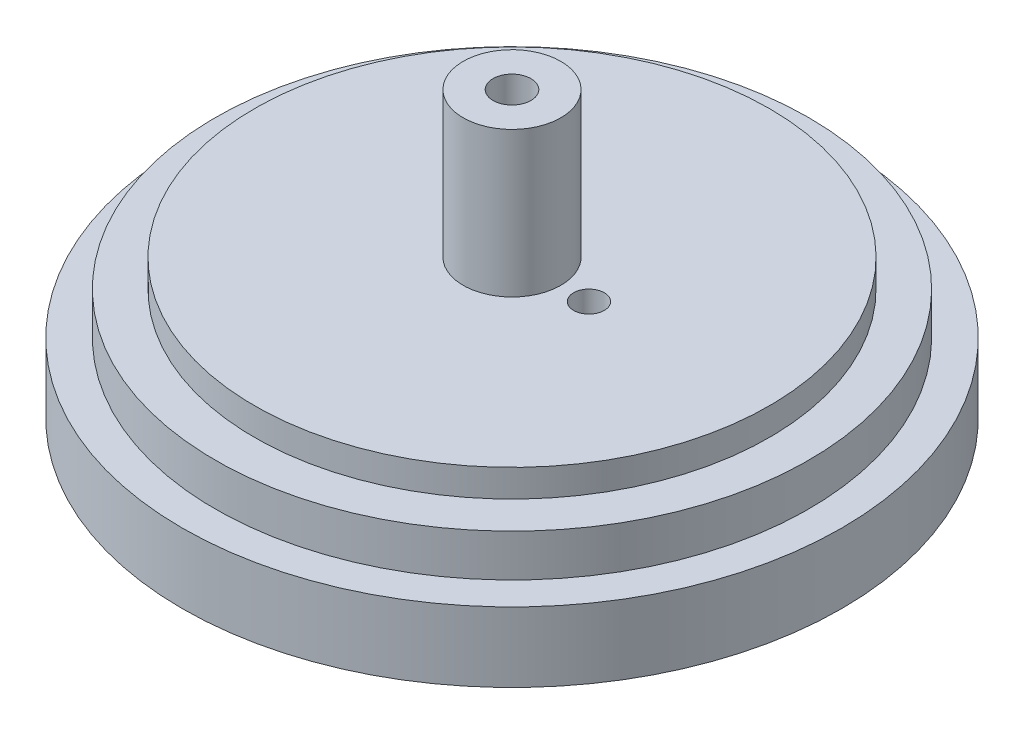
ISO-10303-21;
HEADER;
FILE_DESCRIPTION(('STEP AP214'),'2;1');
FILE_NAME('part.step','',(''),(''),'','','');
FILE_SCHEMA(('AUTOMOTIVE_DESIGN { 1 0 10303 214 1 1 1 1 }'));
ENDSEC;
DATA;
#1=APPLICATION_CONTEXT('core data for automotive mechanical design processes');
#2=APPLICATION_PROTOCOL_DEFINITION('international standard','automotive_design',2000,#1);
#3=PRODUCT_CONTEXT('',#1,'mechanical');
#4=PRODUCT('Part','Part','',(#3));
#5=PRODUCT_RELATED_PRODUCT_CATEGORY('part','',(#4));
#6=PRODUCT_DEFINITION_FORMATION('','',#4);
#7=PRODUCT_DEFINITION_CONTEXT('part definition',#1,'design');
#8=PRODUCT_DEFINITION('design','',#6,#7);
#9=PRODUCT_DEFINITION_SHAPE('','',#8);
#10=(LENGTH_UNIT() NAMED_UNIT(*) SI_UNIT(.MILLI.,.METRE.));
#11=(NAMED_UNIT(*) PLANE_ANGLE_UNIT() SI_UNIT($,.RADIAN.));
#12=(NAMED_UNIT(*) SI_UNIT($,.STERADIAN.) SOLID_ANGLE_UNIT());
#13=UNCERTAINTY_MEASURE_WITH_UNIT(LENGTH_MEASURE(1.E-05),#10,'distance_accuracy_value','');
#14=(GEOMETRIC_REPRESENTATION_CONTEXT(3) GLOBAL_UNCERTAINTY_ASSIGNED_CONTEXT((#13)) GLOBAL_UNIT_ASSIGNED_CONTEXT((#10,
#11,#12)) REPRESENTATION_CONTEXT('',''));
#15=CARTESIAN_POINT('',(0.,0.,0.));
#16=DIRECTION('',(0.,0.,1.));
#17=DIRECTION('',(1.,0.,0.));
#18=AXIS2_PLACEMENT_3D('',#15,#16,#17);
#19=CARTESIAN_POINT('',(0.,13.208,0.));
#20=DIRECTION('',(0.,1.,0.));
#21=DIRECTION('',(0.,0.,1.));
#22=AXIS2_PLACEMENT_3D('',#19,#20,#21);
#23=CYLINDRICAL_SURFACE('',#22,1.72719999999999);
#24=CARTESIAN_POINT('',(0.,13.208,0.));
#25=DIRECTION('',(0.,1.,0.));
#26=DIRECTION('',(0.,0.,1.));
#27=AXIS2_PLACEMENT_3D('',#24,#25,#26);
#28=CIRCLE('',#27,1.72719999999999);
#29=CARTESIAN_POINT('',(0.,13.208,1.72719999999999));
#30=VERTEX_POINT('',#29);
#31=EDGE_CURVE('E143',#30,#30,#28,.T.);
#32=ORIENTED_EDGE('',*,*,#31,.T.);
#33=EDGE_LOOP('',(#32));
#34=FACE_BOUND('',#33,.T.);
#35=CARTESIAN_POINT('',(0.,-4.2,0.));
#36=DIRECTION('',(0.,-1.,0.));
#37=DIRECTION('',(0.,0.,-1.));
#38=AXIS2_PLACEMENT_3D('',#35,#36,#37);
#39=CIRCLE('',#38,1.72719999999999);
#40=CARTESIAN_POINT('',(0.,-4.2,-1.72719999999999));
#41=VERTEX_POINT('',#40);
#42=EDGE_CURVE('E38',#41,#41,#39,.F.);
#43=ORIENTED_EDGE('',*,*,#42,.F.);
#44=EDGE_LOOP('',(#43));
#45=FACE_BOUND('',#44,.T.);
#46=ADVANCED_FACE('F34',(#34,#45),#23,.F.);
#47=CARTESIAN_POINT('',(0.,0.,0.));
#48=DIRECTION('',(0.,-1.,0.));
#49=DIRECTION('',(0.,0.,-1.));
#50=AXIS2_PLACEMENT_3D('',#47,#48,#49);
#51=PLANE('',#50);
#52=CARTESIAN_POINT('',(0.,0.,0.));
#53=DIRECTION('',(0.,-1.,0.));
#54=DIRECTION('',(0.,0.,-1.));
#55=AXIS2_PLACEMENT_3D('',#52,#53,#54);
#56=CIRCLE('',#55,4.445);
#57=CARTESIAN_POINT('',(0.,0.,-4.445));
#58=VERTEX_POINT('',#57);
#59=EDGE_CURVE('E11',#58,#58,#56,.F.);
#60=ORIENTED_EDGE('',*,*,#59,.F.);
#61=EDGE_LOOP('',(#60));
#62=FACE_BOUND('',#61,.T.);
#63=CARTESIAN_POINT('',(7.,0.,0.));
#64=DIRECTION('',(0.,-1.,0.));
#65=DIRECTION('',(0.,0.,-1.));
#66=AXIS2_PLACEMENT_3D('',#63,#64,#65);
#67=CIRCLE('',#66,1.397);
#68=CARTESIAN_POINT('',(7.,0.,1.397));
#69=VERTEX_POINT('',#68);
#70=EDGE_CURVE('E150',#69,#69,#67,.T.);
#71=ORIENTED_EDGE('',*,*,#70,.T.);
#72=EDGE_LOOP('',(#71));
#73=FACE_BOUND('',#72,.T.);
#74=CARTESIAN_POINT('',(0.,0.,0.));
#75=DIRECTION('',(0.,-1.,0.));
#76=DIRECTION('',(0.,0.,-1.));
#77=AXIS2_PLACEMENT_3D('',#74,#75,#76);
#78=CIRCLE('',#77,23.425);
#79=CARTESIAN_POINT('',(0.,0.,-23.425));
#80=VERTEX_POINT('',#79);
#81=EDGE_CURVE('E43',#80,#80,#78,.T.);
#82=ORIENTED_EDGE('',*,*,#81,.F.);
#83=EDGE_LOOP('',(#82));
#84=FACE_BOUND('',#83,.T.);
#85=ADVANCED_FACE('F36',(#62,#73,#84),#51,.F.);
#86=CARTESIAN_POINT('',(0.,-12.7,0.));
#87=DIRECTION('',(0.,-1.,0.));
#88=DIRECTION('',(0.,0.,-1.));
#89=AXIS2_PLACEMENT_3D('',#86,#87,#88);
#90=CYLINDRICAL_SURFACE('',#89,23.425);
#91=CARTESIAN_POINT('',(0.,-2.5,0.));
#92=DIRECTION('',(0.,-1.,0.));
#93=DIRECTION('',(0.,0.,-1.));
#94=AXIS2_PLACEMENT_3D('',#91,#92,#93);
#95=CIRCLE('',#94,23.425);
#96=CARTESIAN_POINT('',(0.,-2.5,-23.425));
#97=VERTEX_POINT('',#96);
#98=EDGE_CURVE('E167',#97,#97,#95,.T.);
#99=ORIENTED_EDGE('',*,*,#98,.F.);
#100=EDGE_LOOP('',(#99));
#101=FACE_BOUND('',#100,.T.);
#102=ORIENTED_EDGE('',*,*,#81,.T.);
#103=EDGE_LOOP('',(#102));
#104=FACE_BOUND('',#103,.T.);
#105=ADVANCED_FACE('F173',(#101,#104),#90,.T.);
#106=CARTESIAN_POINT('',(-27.,-2.5,0.));
#107=DIRECTION('',(0.,-1.,0.));
#108=DIRECTION('',(0.,0.,-1.));
#109=AXIS2_PLACEMENT_3D('',#106,#107,#108);
#110=PLANE('',#109);
#111=CARTESIAN_POINT('',(0.,-2.5,0.));
#112=DIRECTION('',(0.,-1.,0.));
#113=DIRECTION('',(0.,0.,-1.));
#114=AXIS2_PLACEMENT_3D('',#111,#112,#113);
#115=CIRCLE('',#114,27.);
#116=CARTESIAN_POINT('',(0.,-2.5,-27.));
#117=VERTEX_POINT('',#116);
#118=EDGE_CURVE('E164',#117,#117,#115,.T.);
#119=ORIENTED_EDGE('',*,*,#118,.F.);
#120=EDGE_LOOP('',(#119));
#121=FACE_BOUND('',#120,.T.);
#122=ORIENTED_EDGE('',*,*,#98,.T.);
#123=EDGE_LOOP('',(#122));
#124=FACE_BOUND('',#123,.T.);
#125=ADVANCED_FACE('F181',(#121,#124),#110,.F.);
#126=CARTESIAN_POINT('',(0.,-12.7,0.));
#127=DIRECTION('',(0.,-1.,0.));
#128=DIRECTION('',(0.,0.,-1.));
#129=AXIS2_PLACEMENT_3D('',#126,#127,#128);
#130=CYLINDRICAL_SURFACE('',#129,27.);
#131=CARTESIAN_POINT('',(0.,-6.35,0.));
#132=DIRECTION('',(0.,-1.,0.));
#133=DIRECTION('',(0.,0.,-1.));
#134=AXIS2_PLACEMENT_3D('',#131,#132,#133);
#135=CIRCLE('',#134,27.);
#136=CARTESIAN_POINT('',(0.,-6.35,-27.));
#137=VERTEX_POINT('',#136);
#138=EDGE_CURVE('E161',#137,#137,#135,.T.);
#139=ORIENTED_EDGE('',*,*,#138,.F.);
#140=EDGE_LOOP('',(#139));
#141=FACE_BOUND('',#140,.T.);
#142=ORIENTED_EDGE('',*,*,#118,.T.);
#143=EDGE_LOOP('',(#142));
#144=FACE_BOUND('',#143,.T.);
#145=ADVANCED_FACE('F212',(#141,#144),#130,.T.);
#146=CARTESIAN_POINT('',(-30.,-6.35,0.));
#147=DIRECTION('',(0.,-1.,0.));
#148=DIRECTION('',(0.,0.,-1.));
#149=AXIS2_PLACEMENT_3D('',#146,#147,#148);
#150=PLANE('',#149);
#151=CARTESIAN_POINT('',(0.,-6.35,0.));
#152=DIRECTION('',(0.,-1.,0.));
#153=DIRECTION('',(0.,0.,-1.));
#154=AXIS2_PLACEMENT_3D('',#151,#152,#153);
#155=CIRCLE('',#154,30.);
#156=CARTESIAN_POINT('',(0.,-6.35,-30.));
#157=VERTEX_POINT('',#156);
#158=EDGE_CURVE('E158',#157,#157,#155,.T.);
#159=ORIENTED_EDGE('',*,*,#158,.F.);
#160=EDGE_LOOP('',(#159));
#161=FACE_BOUND('',#160,.T.);
#162=ORIENTED_EDGE('',*,*,#138,.T.);
#163=EDGE_LOOP('',(#162));
#164=FACE_BOUND('',#163,.T.);
#165=ADVANCED_FACE('F206',(#161,#164),#150,.F.);
#166=CARTESIAN_POINT('',(0.,-12.7,0.));
#167=DIRECTION('',(0.,-1.,0.));
#168=DIRECTION('',(0.,0.,-1.));
#169=AXIS2_PLACEMENT_3D('',#166,#167,#168);
#170=CYLINDRICAL_SURFACE('',#169,30.);
#171=CARTESIAN_POINT('',(0.,-12.7,0.));
#172=DIRECTION('',(0.,-1.,0.));
#173=DIRECTION('',(0.,0.,-1.));
#174=AXIS2_PLACEMENT_3D('',#171,#172,#173);
#175=CIRCLE('',#174,30.);
#176=CARTESIAN_POINT('',(0.,-12.7,-30.));
#177=VERTEX_POINT('',#176);
#178=EDGE_CURVE('E153',#177,#177,#175,.T.);
#179=ORIENTED_EDGE('',*,*,#178,.F.);
#180=EDGE_LOOP('',(#179));
#181=FACE_BOUND('',#180,.T.);
#182=ORIENTED_EDGE('',*,*,#158,.T.);
#183=EDGE_LOOP('',(#182));
#184=FACE_BOUND('',#183,.T.);
#185=ADVANCED_FACE('F199',(#181,#184),#170,.T.);
#186=CARTESIAN_POINT('',(-30.,-12.7,0.));
#187=DIRECTION('',(0.,1.,0.));
#188=DIRECTION('',(0.,0.,1.));
#189=AXIS2_PLACEMENT_3D('',#186,#187,#188);
#190=PLANE('',#189);
#191=DIRECTION('',(-0.866025403784438,0.,-0.5));
#192=VECTOR('',#191,1.);
#193=CARTESIAN_POINT('',(0.,-12.7,3.81282117772829));
#194=LINE('',#193,#192);
#195=CARTESIAN_POINT('',(0.,-12.7,3.81282117772829));
#196=VERTEX_POINT('',#195);
#197=CARTESIAN_POINT('',(-3.302,-12.7,1.90641058886414));
#198=VERTEX_POINT('',#197);
#199=EDGE_CURVE('E125',#196,#198,#194,.T.);
#200=ORIENTED_EDGE('',*,*,#199,.F.);
#201=DIRECTION('',(-0.866025403784439,0.,0.5));
#202=VECTOR('',#201,1.);
#203=CARTESIAN_POINT('',(3.302,-12.7,1.90641058886414));
#204=LINE('',#203,#202);
#205=CARTESIAN_POINT('',(3.302,-12.7,1.90641058886414));
#206=VERTEX_POINT('',#205);
#207=EDGE_CURVE('E50',#206,#196,#204,.T.);
#208=ORIENTED_EDGE('',*,*,#207,.F.);
#209=DIRECTION('',(0.,0.,1.));
#210=VECTOR('',#209,1.);
#211=CARTESIAN_POINT('',(3.302,-12.7,-1.90641058886414));
#212=LINE('',#211,#210);
#213=CARTESIAN_POINT('',(3.302,-12.7,-1.90641058886414));
#214=VERTEX_POINT('',#213);
#215=EDGE_CURVE('E134',#214,#206,#212,.T.);
#216=ORIENTED_EDGE('',*,*,#215,.F.);
#217=DIRECTION('',(0.866025403784439,0.,0.5));
#218=VECTOR('',#217,1.);
#219=CARTESIAN_POINT('',(0.,-12.7,-3.81282117772829));
#220=LINE('',#219,#218);
#221=CARTESIAN_POINT('',(0.,-12.7,-3.81282117772829));
#222=VERTEX_POINT('',#221);
#223=EDGE_CURVE('E132',#222,#214,#220,.T.);
#224=ORIENTED_EDGE('',*,*,#223,.F.);
#225=DIRECTION('',(0.866025403784439,0.,-0.5));
#226=VECTOR('',#225,1.);
#227=CARTESIAN_POINT('',(-3.302,-12.7,-1.90641058886415));
#228=LINE('',#227,#226);
#229=CARTESIAN_POINT('',(-3.302,-12.7,-1.90641058886415));
#230=VERTEX_POINT('',#229);
#231=EDGE_CURVE('E98',#230,#222,#228,.T.);
#232=ORIENTED_EDGE('',*,*,#231,.F.);
#233=DIRECTION('',(0.,0.,-1.));
#234=VECTOR('',#233,1.);
#235=CARTESIAN_POINT('',(-3.302,-12.7,1.90641058886414));
#236=LINE('',#235,#234);
#237=EDGE_CURVE('E128',#198,#230,#236,.T.);
#238=ORIENTED_EDGE('',*,*,#237,.F.);
#239=EDGE_LOOP('',(#200,#208,#216,#224,#232,#238));
#240=FACE_BOUND('',#239,.T.);
#241=CARTESIAN_POINT('',(7.,-12.7,0.));
#242=DIRECTION('',(0.,1.,0.));
#243=DIRECTION('',(0.,0.,1.));
#244=AXIS2_PLACEMENT_3D('',#241,#242,#243);
#245=CIRCLE('',#244,1.397);
#246=CARTESIAN_POINT('',(7.,-12.7,1.397));
#247=VERTEX_POINT('',#246);
#248=EDGE_CURVE('E149',#247,#247,#245,.T.);
#249=ORIENTED_EDGE('',*,*,#248,.T.);
#250=EDGE_LOOP('',(#249));
#251=FACE_BOUND('',#250,.T.);
#252=ORIENTED_EDGE('',*,*,#178,.T.);
#253=EDGE_LOOP('',(#252));
#254=FACE_BOUND('',#253,.T.);
#255=ADVANCED_FACE('F193',(#240,#251,#254),#190,.F.);
#256=CARTESIAN_POINT('',(7.,-12.701,0.));
#257=DIRECTION('',(0.,1.,0.));
#258=DIRECTION('',(0.,0.,1.));
#259=AXIS2_PLACEMENT_3D('',#256,#257,#258);
#260=CYLINDRICAL_SURFACE('',#259,1.397);
#261=CARTESIAN_POINT('',(7.,0.,1.397));
#262=CARTESIAN_POINT('',(7.,-0.132291666666667,1.397));
#263=CARTESIAN_POINT('',(7.,-0.264583333333333,1.397));
#264=CARTESIAN_POINT('',(7.,-0.529166666666667,1.397));
#265=CARTESIAN_POINT('',(7.,-0.661458333333334,1.397));
#266=CARTESIAN_POINT('',(7.,-0.926041666666668,1.397));
#267=CARTESIAN_POINT('',(7.,-1.05833333333333,1.397));
#268=CARTESIAN_POINT('',(7.,-1.32291666666667,1.397));
#269=CARTESIAN_POINT('',(7.,-1.45520833333333,1.397));
#270=CARTESIAN_POINT('',(7.,-1.71979166666667,1.397));
#271=CARTESIAN_POINT('',(7.,-1.85208333333333,1.397));
#272=CARTESIAN_POINT('',(7.,-2.11666666666667,1.397));
#273=CARTESIAN_POINT('',(7.,-2.24895833333333,1.397));
#274=CARTESIAN_POINT('',(7.,-2.51354166666667,1.397));
#275=CARTESIAN_POINT('',(7.,-2.64583333333333,1.397));
#276=CARTESIAN_POINT('',(7.,-2.91041666666667,1.397));
#277=CARTESIAN_POINT('',(7.,-3.04270833333333,1.397));
#278=CARTESIAN_POINT('',(7.,-3.30729166666667,1.397));
#279=CARTESIAN_POINT('',(7.,-3.43958333333333,1.397));
#280=CARTESIAN_POINT('',(7.,-3.70416666666667,1.397));
#281=CARTESIAN_POINT('',(7.,-3.83645833333334,1.397));
#282=CARTESIAN_POINT('',(7.,-4.10104166666667,1.397));
#283=CARTESIAN_POINT('',(7.,-4.23333333333333,1.397));
#284=CARTESIAN_POINT('',(7.,-4.49791666666667,1.397));
#285=CARTESIAN_POINT('',(7.,-4.63020833333334,1.397));
#286=CARTESIAN_POINT('',(7.,-4.89479166666667,1.397));
#287=CARTESIAN_POINT('',(7.,-5.02708333333334,1.397));
#288=CARTESIAN_POINT('',(7.,-5.29166666666667,1.397));
#289=CARTESIAN_POINT('',(7.,-5.42395833333333,1.397));
#290=CARTESIAN_POINT('',(7.,-5.68854166666667,1.397));
#291=CARTESIAN_POINT('',(7.,-5.82083333333333,1.397));
#292=CARTESIAN_POINT('',(7.,-6.08541666666667,1.397));
#293=CARTESIAN_POINT('',(7.,-6.21770833333334,1.397));
#294=CARTESIAN_POINT('',(7.,-6.48229166666667,1.397));
#295=CARTESIAN_POINT('',(7.,-6.61458333333334,1.397));
#296=CARTESIAN_POINT('',(7.,-6.87916666666667,1.397));
#297=CARTESIAN_POINT('',(7.,-7.01145833333334,1.397));
#298=CARTESIAN_POINT('',(7.,-7.27604166666667,1.397));
#299=CARTESIAN_POINT('',(7.,-7.40833333333334,1.397));
#300=CARTESIAN_POINT('',(7.,-7.67291666666667,1.397));
#301=CARTESIAN_POINT('',(7.,-7.80520833333334,1.397));
#302=CARTESIAN_POINT('',(7.,-8.06979166666667,1.397));
#303=CARTESIAN_POINT('',(7.,-8.20208333333334,1.397));
#304=CARTESIAN_POINT('',(7.,-8.46666666666667,1.397));
#305=CARTESIAN_POINT('',(7.,-8.59895833333334,1.397));
#306=CARTESIAN_POINT('',(7.,-8.86354166666667,1.397));
#307=CARTESIAN_POINT('',(7.,-8.99583333333334,1.397));
#308=CARTESIAN_POINT('',(7.,-9.26041666666667,1.397));
#309=CARTESIAN_POINT('',(7.,-9.39270833333334,1.397));
#310=CARTESIAN_POINT('',(7.,-9.65729166666667,1.397));
#311=CARTESIAN_POINT('',(7.,-9.78958333333334,1.397));
#312=CARTESIAN_POINT('',(7.,-10.0541666666667,1.397));
#313=CARTESIAN_POINT('',(7.,-10.1864583333333,1.397));
#314=CARTESIAN_POINT('',(7.,-10.4510416666667,1.397));
#315=CARTESIAN_POINT('',(7.,-10.5833333333333,1.397));
#316=CARTESIAN_POINT('',(7.,-10.8479166666667,1.397));
#317=CARTESIAN_POINT('',(7.,-10.9802083333333,1.397));
#318=CARTESIAN_POINT('',(7.,-11.2447916666667,1.397));
#319=CARTESIAN_POINT('',(7.,-11.3770833333333,1.397));
#320=CARTESIAN_POINT('',(7.,-11.6416666666667,1.397));
#321=CARTESIAN_POINT('',(7.,-11.7739583333333,1.397));
#322=CARTESIAN_POINT('',(7.,-12.0385416666667,1.397));
#323=CARTESIAN_POINT('',(7.,-12.1708333333333,1.397));
#324=CARTESIAN_POINT('',(7.,-12.4354166666667,1.397));
#325=CARTESIAN_POINT('',(7.,-12.5677083333333,1.397));
#326=CARTESIAN_POINT('',(7.,-12.7,1.397));
#327=B_SPLINE_CURVE_WITH_KNOTS('',3,(#261,#262,#263,#264,#265,#266,#267,#268,#269,#270,#271,
#272,#273,#274,#275,#276,#277,#278,#279,#280,#281,#282,#283,#284,#285,#286,#287,#288,#289,#290,
#291,#292,#293,#294,#295,#296,#297,#298,#299,#300,#301,#302,#303,#304,#305,#306,#307,#308,#309,
#310,#311,#312,#313,#314,#315,#316,#317,#318,#319,#320,#321,#322,#323,#324,#325,#326),
.UNSPECIFIED.,.F.,.F.,(4,2,2,2,2,2,2,2,2,2,2,2,2,2,2,2,2,2,2,2,2,2,2,2,2,2,2,2,2,2,2,2,4),(0.,
0.396875,0.793750000000001,1.190625,1.5875,1.984375,2.38125,2.778125,3.175,3.571875,3.96875,
4.365625,4.7625,5.159375,5.55625,5.953125,6.35,6.746875,7.14375,7.540625,7.9375,8.334375,
8.73125,9.128125,9.525,9.921875,10.31875,10.715625,11.1125,11.509375,11.90625,12.303125,12.7),.UNSPECIFIED.);
#328=EDGE_CURVE('BSEAM189',#69,#247,#327,.T.);
#329=ORIENTED_EDGE('',*,*,#70,.F.);
#330=ORIENTED_EDGE('',*,*,#248,.F.);
#331=ORIENTED_EDGE('',*,*,#328,.T.);
#332=ORIENTED_EDGE('',*,*,#328,.F.);
#333=EDGE_LOOP('',(#329,#331,#330,#332));
#334=FACE_BOUND('',#333,.T.);
#335=ADVANCED_FACE('F189',(#334),#260,.F.);
#336=CARTESIAN_POINT('',(0.,13.208,0.));
#337=DIRECTION('',(0.,-1.,0.));
#338=DIRECTION('',(0.,0.,-1.));
#339=AXIS2_PLACEMENT_3D('',#336,#337,#338);
#340=CYLINDRICAL_SURFACE('',#339,4.445);
#341=CARTESIAN_POINT('',(0.,13.208,0.));
#342=DIRECTION('',(0.,1.,0.));
#343=DIRECTION('',(0.,0.,1.));
#344=AXIS2_PLACEMENT_3D('',#341,#342,#343);
#345=CIRCLE('',#344,4.445);
#346=CARTESIAN_POINT('',(0.,13.208,-4.445));
#347=VERTEX_POINT('',#346);
#348=EDGE_CURVE('E146',#347,#347,#345,.T.);
#349=CARTESIAN_POINT('',(0.,13.208,-4.445));
#350=CARTESIAN_POINT('',(0.,13.0704166666667,-4.445));
#351=CARTESIAN_POINT('',(0.,12.9328333333333,-4.445));
#352=CARTESIAN_POINT('',(0.,12.6576666666667,-4.445));
#353=CARTESIAN_POINT('',(0.,12.5200833333333,-4.445));
#354=CARTESIAN_POINT('',(0.,12.2449166666667,-4.445));
#355=CARTESIAN_POINT('',(0.,12.1073333333333,-4.445));
#356=CARTESIAN_POINT('',(0.,11.8321666666667,-4.445));
#357=CARTESIAN_POINT('',(0.,11.6945833333333,-4.445));
#358=CARTESIAN_POINT('',(0.,11.4194166666667,-4.445));
#359=CARTESIAN_POINT('',(0.,11.2818333333333,-4.445));
#360=CARTESIAN_POINT('',(0.,11.0066666666667,-4.445));
#361=CARTESIAN_POINT('',(0.,10.8690833333333,-4.445));
#362=CARTESIAN_POINT('',(0.,10.5939166666667,-4.445));
#363=CARTESIAN_POINT('',(0.,10.4563333333333,-4.445));
#364=CARTESIAN_POINT('',(0.,10.1811666666667,-4.445));
#365=CARTESIAN_POINT('',(0.,10.0435833333333,-4.445));
#366=CARTESIAN_POINT('',(0.,9.76841666666667,-4.445));
#367=CARTESIAN_POINT('',(0.,9.63083333333333,-4.445));
#368=CARTESIAN_POINT('',(0.,9.35566666666666,-4.445));
#369=CARTESIAN_POINT('',(0.,9.21808333333333,-4.445));
#370=CARTESIAN_POINT('',(0.,8.94291666666667,-4.445));
#371=CARTESIAN_POINT('',(0.,8.80533333333333,-4.445));
#372=CARTESIAN_POINT('',(0.,8.53016666666666,-4.445));
#373=CARTESIAN_POINT('',(0.,8.39258333333333,-4.445));
#374=CARTESIAN_POINT('',(0.,8.11741666666667,-4.445));
#375=CARTESIAN_POINT('',(0.,7.97983333333333,-4.445));
#376=CARTESIAN_POINT('',(0.,7.70466666666667,-4.445));
#377=CARTESIAN_POINT('',(0.,7.56708333333333,-4.445));
#378=CARTESIAN_POINT('',(0.,7.29191666666667,-4.445));
#379=CARTESIAN_POINT('',(0.,7.15433333333333,-4.445));
#380=CARTESIAN_POINT('',(0.,6.87916666666667,-4.445));
#381=CARTESIAN_POINT('',(0.,6.74158333333333,-4.445));
#382=CARTESIAN_POINT('',(0.,6.46641666666667,-4.445));
#383=CARTESIAN_POINT('',(0.,6.32883333333333,-4.445));
#384=CARTESIAN_POINT('',(0.,6.05366666666667,-4.445));
#385=CARTESIAN_POINT('',(0.,5.91608333333333,-4.445));
#386=CARTESIAN_POINT('',(0.,5.64091666666667,-4.445));
#387=CARTESIAN_POINT('',(0.,5.50333333333333,-4.445));
#388=CARTESIAN_POINT('',(0.,5.22816666666667,-4.445));
#389=CARTESIAN_POINT('',(0.,5.09058333333333,-4.445));
#390=CARTESIAN_POINT('',(0.,4.81541666666667,-4.445));
#391=CARTESIAN_POINT('',(0.,4.67783333333333,-4.445));
#392=CARTESIAN_POINT('',(0.,4.40266666666667,-4.445));
#393=CARTESIAN_POINT('',(0.,4.26508333333333,-4.445));
#394=CARTESIAN_POINT('',(0.,3.98991666666667,-4.445));
#395=CARTESIAN_POINT('',(0.,3.85233333333333,-4.445));
#396=CARTESIAN_POINT('',(0.,3.57716666666667,-4.445));
#397=CARTESIAN_POINT('',(0.,3.43958333333333,-4.445));
#398=CARTESIAN_POINT('',(0.,3.16441666666667,-4.445));
#399=CARTESIAN_POINT('',(0.,3.02683333333333,-4.445));
#400=CARTESIAN_POINT('',(0.,2.75166666666667,-4.445));
#401=CARTESIAN_POINT('',(0.,2.61408333333333,-4.445));
#402=CARTESIAN_POINT('',(0.,2.33891666666667,-4.445));
#403=CARTESIAN_POINT('',(0.,2.20133333333333,-4.445));
#404=CARTESIAN_POINT('',(0.,1.92616666666667,-4.445));
#405=CARTESIAN_POINT('',(0.,1.78858333333333,-4.445));
#406=CARTESIAN_POINT('',(0.,1.51341666666667,-4.445));
#407=CARTESIAN_POINT('',(0.,1.37583333333333,-4.445));
#408=CARTESIAN_POINT('',(0.,1.10066666666667,-4.445));
#409=CARTESIAN_POINT('',(0.,0.963083333333333,-4.445));
#410=CARTESIAN_POINT('',(0.,0.687916666666667,-4.445));
#411=CARTESIAN_POINT('',(0.,0.550333333333333,-4.445));
#412=CARTESIAN_POINT('',(0.,0.275166666666667,-4.445));
#413=CARTESIAN_POINT('',(0.,0.137583333333333,-4.445));
#414=CARTESIAN_POINT('',(0.,0.,-4.445));
#415=B_SPLINE_CURVE_WITH_KNOTS('',3,(#349,#350,#351,#352,#353,#354,#355,#356,#357,#358,#359,
#360,#361,#362,#363,#364,#365,#366,#367,#368,#369,#370,#371,#372,#373,#374,#375,#376,#377,#378,
#379,#380,#381,#382,#383,#384,#385,#386,#387,#388,#389,#390,#391,#392,#393,#394,#395,#396,#397,
#398,#399,#400,#401,#402,#403,#404,#405,#406,#407,#408,#409,#410,#411,#412,#413,#414),
.UNSPECIFIED.,.F.,.F.,(4,2,2,2,2,2,2,2,2,2,2,2,2,2,2,2,2,2,2,2,2,2,2,2,2,2,2,2,2,2,2,2,4),(0.,
0.412750000000002,0.825500000000002,1.23825,1.651,2.06375,2.4765,2.88925,3.302,3.71475,4.1275,
4.54025,4.953,5.36575,5.7785,6.19125,6.604,7.01675,7.4295,7.84225,8.255,8.66775,9.0805,9.49325,
9.906,10.31875,10.7315,11.14425,11.557,11.96975,12.3825,12.79525,13.208),.UNSPECIFIED.);
#416=EDGE_CURVE('BSEAM192',#347,#58,#415,.T.);
#417=ORIENTED_EDGE('',*,*,#348,.F.);
#418=ORIENTED_EDGE('',*,*,#59,.T.);
#419=ORIENTED_EDGE('',*,*,#416,.T.);
#420=ORIENTED_EDGE('',*,*,#416,.F.);
#421=EDGE_LOOP('',(#417,#419,#418,#420));
#422=FACE_BOUND('',#421,.T.);
#423=ADVANCED_FACE('F192',(#422),#340,.T.);
#424=CARTESIAN_POINT('',(0.,13.208,0.));
#425=DIRECTION('',(0.,1.,0.));
#426=DIRECTION('',(0.,0.,1.));
#427=AXIS2_PLACEMENT_3D('',#424,#425,#426);
#428=PLANE('',#427);
#429=ORIENTED_EDGE('',*,*,#31,.F.);
#430=EDGE_LOOP('',(#429));
#431=FACE_BOUND('',#430,.T.);
#432=ORIENTED_EDGE('',*,*,#348,.T.);
#433=EDGE_LOOP('',(#432));
#434=FACE_BOUND('',#433,.T.);
#435=ADVANCED_FACE('F230',(#431,#434),#428,.T.);
#436=CARTESIAN_POINT('',(0.,-4.2,0.));
#437=DIRECTION('',(0.,-1.,0.));
#438=DIRECTION('',(0.,0.,-1.));
#439=AXIS2_PLACEMENT_3D('',#436,#437,#438);
#440=PLANE('',#439);
#441=DIRECTION('',(-0.866025403784439,0.,0.5));
#442=VECTOR('',#441,1.);
#443=CARTESIAN_POINT('',(3.302,-4.2,1.90641058886414));
#444=LINE('',#443,#442);
#445=CARTESIAN_POINT('',(3.302,-4.2,1.90641058886414));
#446=VERTEX_POINT('',#445);
#447=CARTESIAN_POINT('',(0.,-4.2,3.81282117772829));
#448=VERTEX_POINT('',#447);
#449=EDGE_CURVE('E136',#446,#448,#444,.T.);
#450=ORIENTED_EDGE('',*,*,#449,.T.);
#451=DIRECTION('',(-0.866025403784438,0.,-0.5));
#452=VECTOR('',#451,1.);
#453=CARTESIAN_POINT('',(0.,-4.2,3.81282117772829));
#454=LINE('',#453,#452);
#455=CARTESIAN_POINT('',(-3.302,-4.2,1.90641058886414));
#456=VERTEX_POINT('',#455);
#457=EDGE_CURVE('E119',#448,#456,#454,.T.);
#458=ORIENTED_EDGE('',*,*,#457,.T.);
#459=DIRECTION('',(0.,0.,-1.));
#460=VECTOR('',#459,1.);
#461=CARTESIAN_POINT('',(-3.302,-4.2,1.90641058886414));
#462=LINE('',#461,#460);
#463=CARTESIAN_POINT('',(-3.302,-4.2,-1.90641058886415));
#464=VERTEX_POINT('',#463);
#465=EDGE_CURVE('E117',#456,#464,#462,.T.);
#466=ORIENTED_EDGE('',*,*,#465,.T.);
#467=DIRECTION('',(0.866025403784439,0.,-0.5));
#468=VECTOR('',#467,1.);
#469=CARTESIAN_POINT('',(-3.302,-4.2,-1.90641058886415));
#470=LINE('',#469,#468);
#471=CARTESIAN_POINT('',(0.,-4.2,-3.81282117772829));
#472=VERTEX_POINT('',#471);
#473=EDGE_CURVE('E95',#464,#472,#470,.T.);
#474=ORIENTED_EDGE('',*,*,#473,.T.);
#475=DIRECTION('',(0.866025403784439,0.,0.5));
#476=VECTOR('',#475,1.);
#477=CARTESIAN_POINT('',(0.,-4.2,-3.81282117772829));
#478=LINE('',#477,#476);
#479=CARTESIAN_POINT('',(3.302,-4.2,-1.90641058886414));
#480=VERTEX_POINT('',#479);
#481=EDGE_CURVE('E106',#472,#480,#478,.T.);
#482=ORIENTED_EDGE('',*,*,#481,.T.);
#483=DIRECTION('',(0.,0.,1.));
#484=VECTOR('',#483,1.);
#485=CARTESIAN_POINT('',(3.302,-4.2,-1.90641058886414));
#486=LINE('',#485,#484);
#487=EDGE_CURVE('E110',#480,#446,#486,.T.);
#488=ORIENTED_EDGE('',*,*,#487,.T.);
#489=EDGE_LOOP('',(#450,#458,#466,#474,#482,#488));
#490=FACE_BOUND('',#489,.T.);
#491=ORIENTED_EDGE('',*,*,#42,.T.);
#492=EDGE_LOOP('',(#491));
#493=FACE_BOUND('',#492,.T.);
#494=ADVANCED_FACE('F113',(#490,#493),#440,.T.);
#495=CARTESIAN_POINT('',(3.302,-4.2,1.90641058886414));
#496=DIRECTION('',(0.5,0.,0.866025403784439));
#497=DIRECTION('',(0.866025403784439,0.,-0.5));
#498=AXIS2_PLACEMENT_3D('',#495,#496,#497);
#499=PLANE('',#498);
#500=ORIENTED_EDGE('',*,*,#207,.T.);
#501=DIRECTION('',(0.,-1.,0.));
#502=VECTOR('',#501,1.);
#503=CARTESIAN_POINT('',(0.,-4.2,3.81282117772829));
#504=LINE('',#503,#502);
#505=EDGE_CURVE('E80',#448,#196,#504,.T.);
#506=ORIENTED_EDGE('',*,*,#505,.F.);
#507=ORIENTED_EDGE('',*,*,#449,.F.);
#508=DIRECTION('',(0.,-1.,0.));
#509=VECTOR('',#508,1.);
#510=CARTESIAN_POINT('',(3.302,-4.2,1.90641058886414));
#511=LINE('',#510,#509);
#512=EDGE_CURVE('E58',#446,#206,#511,.T.);
#513=ORIENTED_EDGE('',*,*,#512,.T.);
#514=EDGE_LOOP('',(#500,#506,#507,#513));
#515=FACE_BOUND('',#514,.T.);
#516=ADVANCED_FACE('F235',(#515),#499,.F.);
#517=CARTESIAN_POINT('',(3.302,-4.2,-1.90641058886414));
#518=DIRECTION('',(1.,0.,0.));
#519=DIRECTION('',(0.,0.,-1.));
#520=AXIS2_PLACEMENT_3D('',#517,#518,#519);
#521=PLANE('',#520);
#522=ORIENTED_EDGE('',*,*,#215,.T.);
#523=ORIENTED_EDGE('',*,*,#512,.F.);
#524=ORIENTED_EDGE('',*,*,#487,.F.);
#525=DIRECTION('',(0.,-1.,0.));
#526=VECTOR('',#525,1.);
#527=CARTESIAN_POINT('',(3.302,-4.2,-1.90641058886414));
#528=LINE('',#527,#526);
#529=EDGE_CURVE('E102',#480,#214,#528,.T.);
#530=ORIENTED_EDGE('',*,*,#529,.T.);
#531=EDGE_LOOP('',(#522,#523,#524,#530));
#532=FACE_BOUND('',#531,.T.);
#533=ADVANCED_FACE('F238',(#532),#521,.F.);
#534=CARTESIAN_POINT('',(0.,-4.2,-3.81282117772829));
#535=DIRECTION('',(0.5,0.,-0.866025403784439));
#536=DIRECTION('',(-0.866025403784438,0.,-0.5));
#537=AXIS2_PLACEMENT_3D('',#534,#535,#536);
#538=PLANE('',#537);
#539=ORIENTED_EDGE('',*,*,#223,.T.);
#540=ORIENTED_EDGE('',*,*,#529,.F.);
#541=ORIENTED_EDGE('',*,*,#481,.F.);
#542=DIRECTION('',(0.,-1.,0.));
#543=VECTOR('',#542,1.);
#544=CARTESIAN_POINT('',(0.,-4.2,-3.81282117772829));
#545=LINE('',#544,#543);
#546=EDGE_CURVE('E91',#472,#222,#545,.T.);
#547=ORIENTED_EDGE('',*,*,#546,.T.);
#548=EDGE_LOOP('',(#539,#540,#541,#547));
#549=FACE_BOUND('',#548,.T.);
#550=ADVANCED_FACE('F107',(#549),#538,.F.);
#551=CARTESIAN_POINT('',(-3.302,-4.2,-1.90641058886415));
#552=DIRECTION('',(-0.5,0.,-0.866025403784439));
#553=DIRECTION('',(-0.866025403784439,0.,0.5));
#554=AXIS2_PLACEMENT_3D('',#551,#552,#553);
#555=PLANE('',#554);
#556=ORIENTED_EDGE('',*,*,#231,.T.);
#557=ORIENTED_EDGE('',*,*,#546,.F.);
#558=ORIENTED_EDGE('',*,*,#473,.F.);
#559=DIRECTION('',(0.,-1.,0.));
#560=VECTOR('',#559,1.);
#561=CARTESIAN_POINT('',(-3.302,-4.2,-1.90641058886415));
#562=LINE('',#561,#560);
#563=EDGE_CURVE('E103',#464,#230,#562,.T.);
#564=ORIENTED_EDGE('',*,*,#563,.T.);
#565=EDGE_LOOP('',(#556,#557,#558,#564));
#566=FACE_BOUND('',#565,.T.);
#567=ADVANCED_FACE('F93',(#566),#555,.F.);
#568=CARTESIAN_POINT('',(-3.302,-4.2,1.90641058886414));
#569=DIRECTION('',(-1.,0.,0.));
#570=DIRECTION('',(0.,0.,1.));
#571=AXIS2_PLACEMENT_3D('',#568,#569,#570);
#572=PLANE('',#571);
#573=ORIENTED_EDGE('',*,*,#237,.T.);
#574=ORIENTED_EDGE('',*,*,#563,.F.);
#575=ORIENTED_EDGE('',*,*,#465,.F.);
#576=DIRECTION('',(0.,-1.,0.));
#577=VECTOR('',#576,1.);
#578=CARTESIAN_POINT('',(-3.302,-4.2,1.90641058886414));
#579=LINE('',#578,#577);
#580=EDGE_CURVE('E140',#456,#198,#579,.T.);
#581=ORIENTED_EDGE('',*,*,#580,.T.);
#582=EDGE_LOOP('',(#573,#574,#575,#581));
#583=FACE_BOUND('',#582,.T.);
#584=ADVANCED_FACE('F242',(#583),#572,.F.);
#585=CARTESIAN_POINT('',(0.,-4.2,3.81282117772829));
#586=DIRECTION('',(-0.5,0.,0.866025403784439));
#587=DIRECTION('',(0.866025403784438,0.,0.5));
#588=AXIS2_PLACEMENT_3D('',#585,#586,#587);
#589=PLANE('',#588);
#590=ORIENTED_EDGE('',*,*,#199,.T.);
#591=ORIENTED_EDGE('',*,*,#580,.F.);
#592=ORIENTED_EDGE('',*,*,#457,.F.);
#593=ORIENTED_EDGE('',*,*,#505,.T.);
#594=EDGE_LOOP('',(#590,#591,#592,#593));
#595=FACE_BOUND('',#594,.T.);
#596=ADVANCED_FACE('F239',(#595),#589,.F.);
#597=CLOSED_SHELL('',(#46,#85,#105,#125,#145,#165,#185,#255,#335,#423,#435,#494,#516,#533,#550,
#567,#584,#596));
#598=MANIFOLD_SOLID_BREP('B2',#597);
#599=ADVANCED_BREP_SHAPE_REPRESENTATION('',(#18,#598),#14);
#600=SHAPE_DEFINITION_REPRESENTATION(#9,#599);
ENDSEC;
END-ISO-10303-21;
